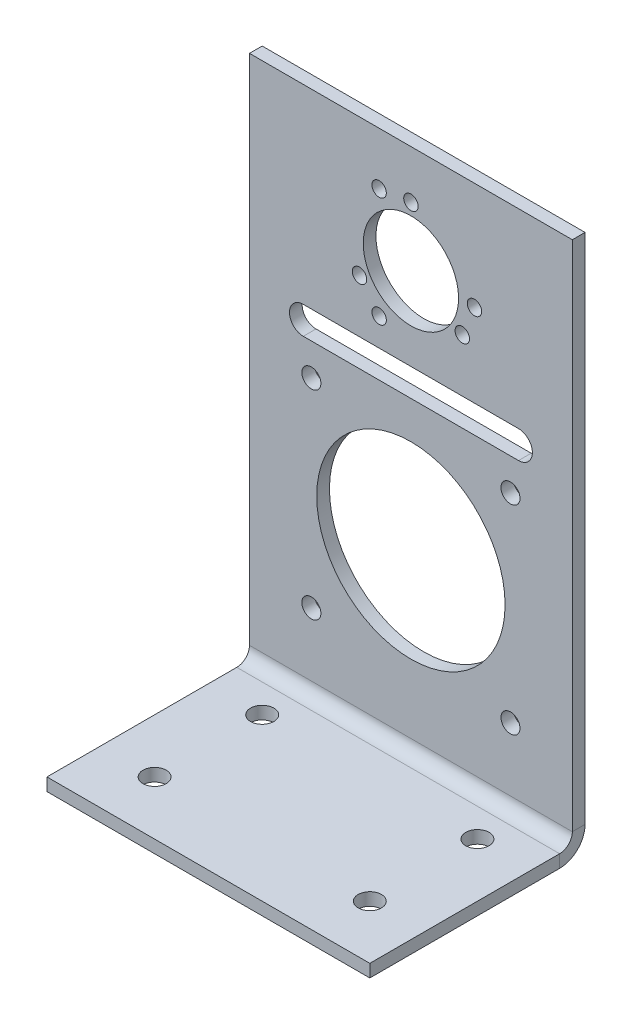
ISO-10303-21;
HEADER;
FILE_DESCRIPTION(('STEP AP214'),'2;1');
FILE_NAME('part.step','',(''),(''),'','','');
FILE_SCHEMA(('AUTOMOTIVE_DESIGN { 1 0 10303 214 1 1 1 1 }'));
ENDSEC;
DATA;
#1=APPLICATION_CONTEXT('core data for automotive mechanical design processes');
#2=APPLICATION_PROTOCOL_DEFINITION('international standard','automotive_design',2000,#1);
#3=PRODUCT_CONTEXT('',#1,'mechanical');
#4=PRODUCT('Part','Part','',(#3));
#5=PRODUCT_RELATED_PRODUCT_CATEGORY('part','',(#4));
#6=PRODUCT_DEFINITION_FORMATION('','',#4);
#7=PRODUCT_DEFINITION_CONTEXT('part definition',#1,'design');
#8=PRODUCT_DEFINITION('design','',#6,#7);
#9=PRODUCT_DEFINITION_SHAPE('','',#8);
#10=(LENGTH_UNIT() NAMED_UNIT(*) SI_UNIT(.MILLI.,.METRE.));
#11=(NAMED_UNIT(*) PLANE_ANGLE_UNIT() SI_UNIT($,.RADIAN.));
#12=(NAMED_UNIT(*) SI_UNIT($,.STERADIAN.) SOLID_ANGLE_UNIT());
#13=UNCERTAINTY_MEASURE_WITH_UNIT(LENGTH_MEASURE(1.E-05),#10,'distance_accuracy_value','');
#14=(GEOMETRIC_REPRESENTATION_CONTEXT(3) GLOBAL_UNCERTAINTY_ASSIGNED_CONTEXT((#13)) GLOBAL_UNIT_ASSIGNED_CONTEXT((#10,
#11,#12)) REPRESENTATION_CONTEXT('',''));
#15=CARTESIAN_POINT('',(0.,0.,0.));
#16=DIRECTION('',(0.,0.,1.));
#17=DIRECTION('',(1.,0.,0.));
#18=AXIS2_PLACEMENT_3D('',#15,#16,#17);
#19=CARTESIAN_POINT('',(38.1,0.,-25.4));
#20=DIRECTION('',(-1.,0.,0.));
#21=DIRECTION('',(0.,-1.,0.));
#22=AXIS2_PLACEMENT_3D('',#19,#20,#21);
#23=PLANE('',#22);
#24=DIRECTION('',(0.,0.,-1.));
#25=VECTOR('',#24,1.);
#26=CARTESIAN_POINT('',(38.1,3.00000000000002,-25.3999999999999));
#27=LINE('',#26,#25);
#28=CARTESIAN_POINT('',(38.1,2.99999999999997,-22.4));
#29=VERTEX_POINT('',#28);
#30=CARTESIAN_POINT('',(38.1,2.99999999999995,-25.4));
#31=VERTEX_POINT('',#30);
#32=EDGE_CURVE('E147',#29,#31,#27,.T.);
#33=ORIENTED_EDGE('',*,*,#32,.T.);
#34=DIRECTION('',(0.,-1.,0.));
#35=VECTOR('',#34,1.);
#36=CARTESIAN_POINT('',(38.1,0.,-25.4));
#37=LINE('',#36,#35);
#38=CARTESIAN_POINT('',(38.1,124.,-25.4000000000004));
#39=VERTEX_POINT('',#38);
#40=EDGE_CURVE('E149',#39,#31,#37,.T.);
#41=ORIENTED_EDGE('',*,*,#40,.F.);
#42=DIRECTION('',(0.,0.,1.));
#43=VECTOR('',#42,1.);
#44=CARTESIAN_POINT('',(38.1,124.,-25.4000000000004));
#45=LINE('',#44,#43);
#46=CARTESIAN_POINT('',(38.1,124.,-22.4000000000004));
#47=VERTEX_POINT('',#46);
#48=EDGE_CURVE('E347',#39,#47,#45,.T.);
#49=ORIENTED_EDGE('',*,*,#48,.T.);
#50=DIRECTION('',(0.,1.,0.));
#51=VECTOR('',#50,1.);
#52=CARTESIAN_POINT('',(38.1,0.,-22.4));
#53=LINE('',#52,#51);
#54=EDGE_CURVE('E81',#47,#29,#53,.F.);
#55=ORIENTED_EDGE('',*,*,#54,.T.);
#56=EDGE_LOOP('',(#33,#41,#49,#55));
#57=FACE_BOUND('',#56,.T.);
#58=ADVANCED_FACE('F59',(#57),#23,.F.);
#59=CARTESIAN_POINT('',(-38.1,124.,-25.4000000000004));
#60=DIRECTION('',(1.,0.,0.));
#61=DIRECTION('',(0.,1.,0.));
#62=AXIS2_PLACEMENT_3D('',#59,#60,#61);
#63=PLANE('',#62);
#64=DIRECTION('',(0.,0.,-1.));
#65=VECTOR('',#64,1.);
#66=CARTESIAN_POINT('',(-38.1,3.00000000000001,-22.4));
#67=LINE('',#66,#65);
#68=CARTESIAN_POINT('',(-38.1,2.99999999999997,-22.4));
#69=VERTEX_POINT('',#68);
#70=CARTESIAN_POINT('',(-38.1,3.00000000000002,-25.4));
#71=VERTEX_POINT('',#70);
#72=EDGE_CURVE('E13',#69,#71,#67,.T.);
#73=ORIENTED_EDGE('',*,*,#72,.F.);
#74=DIRECTION('',(0.,-1.,0.));
#75=VECTOR('',#74,1.);
#76=CARTESIAN_POINT('',(-38.1,124.,-22.4000000000004));
#77=LINE('',#76,#75);
#78=CARTESIAN_POINT('',(-38.1,124.,-22.4000000000004));
#79=VERTEX_POINT('',#78);
#80=EDGE_CURVE('E73',#69,#79,#77,.F.);
#81=ORIENTED_EDGE('',*,*,#80,.T.);
#82=DIRECTION('',(0.,0.,1.));
#83=VECTOR('',#82,1.);
#84=CARTESIAN_POINT('',(-38.1,124.,-25.4000000000004));
#85=LINE('',#84,#83);
#86=CARTESIAN_POINT('',(-38.1,124.,-25.4000000000004));
#87=VERTEX_POINT('',#86);
#88=EDGE_CURVE('E174',#87,#79,#85,.T.);
#89=ORIENTED_EDGE('',*,*,#88,.F.);
#90=DIRECTION('',(0.,1.,0.));
#91=VECTOR('',#90,1.);
#92=CARTESIAN_POINT('',(-38.1,0.,-25.4));
#93=LINE('',#92,#91);
#94=EDGE_CURVE('E163',#71,#87,#93,.T.);
#95=ORIENTED_EDGE('',*,*,#94,.F.);
#96=EDGE_LOOP('',(#73,#81,#89,#95));
#97=FACE_BOUND('',#96,.T.);
#98=ADVANCED_FACE('F388',(#97),#63,.F.);
#99=CARTESIAN_POINT('',(0.,0.,-25.4));
#100=DIRECTION('',(0.,0.,1.));
#101=DIRECTION('',(0.,-1.,0.));
#102=AXIS2_PLACEMENT_3D('',#99,#100,#101);
#103=PLANE('',#102);
#104=CARTESIAN_POINT('',(0.,98.6,-25.400000000004));
#105=DIRECTION('',(0.,0.,1.));
#106=DIRECTION('',(0.,-1.,0.));
#107=AXIS2_PLACEMENT_3D('',#104,#105,#106);
#108=CIRCLE('',#107,11.25);
#109=CARTESIAN_POINT('',(0.,87.35,-25.4000000000039));
#110=VERTEX_POINT('',#109);
#111=EDGE_CURVE('E242',#110,#110,#108,.T.);
#112=ORIENTED_EDGE('',*,*,#111,.T.);
#113=EDGE_LOOP('',(#112));
#114=FACE_BOUND('',#113,.T.);
#115=DIRECTION('',(-1.,0.,0.));
#116=VECTOR('',#115,1.);
#117=CARTESIAN_POINT('',(-25.4,79.0437094716167,-25.4000000000039));
#118=LINE('',#117,#116);
#119=CARTESIAN_POINT('',(25.4,79.0437094716167,-25.4000000000039));
#120=VERTEX_POINT('',#119);
#121=CARTESIAN_POINT('',(-25.4,79.0437094716167,-25.4000000000039));
#122=VERTEX_POINT('',#121);
#123=EDGE_CURVE('E260',#120,#122,#118,.T.);
#124=ORIENTED_EDGE('',*,*,#123,.T.);
#125=CARTESIAN_POINT('',(-25.4,75.7798094716167,-25.4000000000039));
#126=DIRECTION('',(0.,0.,1.));
#127=DIRECTION('',(0.,-1.,0.));
#128=AXIS2_PLACEMENT_3D('',#125,#126,#127);
#129=CIRCLE('',#128,3.2639);
#130=CARTESIAN_POINT('',(-25.4,72.5159094716167,-25.4000000000039));
#131=VERTEX_POINT('',#130);
#132=EDGE_CURVE('E250',#122,#131,#129,.T.);
#133=ORIENTED_EDGE('',*,*,#132,.T.);
#134=DIRECTION('',(1.,0.,0.));
#135=VECTOR('',#134,1.);
#136=CARTESIAN_POINT('',(-25.4,72.5159094716167,-25.4000000000039));
#137=LINE('',#136,#135);
#138=CARTESIAN_POINT('',(25.4,72.5159094716167,-25.4000000000002));
#139=VERTEX_POINT('',#138);
#140=EDGE_CURVE('E253',#131,#139,#137,.T.);
#141=ORIENTED_EDGE('',*,*,#140,.T.);
#142=CARTESIAN_POINT('',(25.4,75.7798094716167,-25.4000000000039));
#143=DIRECTION('',(0.,0.,1.));
#144=DIRECTION('',(0.,-1.,0.));
#145=AXIS2_PLACEMENT_3D('',#142,#143,#144);
#146=CIRCLE('',#145,3.2639);
#147=EDGE_CURVE('E257',#139,#120,#146,.T.);
#148=ORIENTED_EDGE('',*,*,#147,.T.);
#149=EDGE_LOOP('',(#124,#133,#141,#148));
#150=FACE_BOUND('',#149,.T.);
#151=CARTESIAN_POINT('',(12.1243556529822,91.6000000000001,-25.4000000000028));
#152=DIRECTION('',(0.,0.,1.));
#153=DIRECTION('',(0.,-1.,0.));
#154=AXIS2_PLACEMENT_3D('',#151,#152,#153);
#155=CIRCLE('',#154,1.7);
#156=CARTESIAN_POINT('',(12.1243556529822,89.9000000000001,-25.4000000000028));
#157=VERTEX_POINT('',#156);
#158=EDGE_CURVE('E282',#157,#157,#155,.T.);
#159=ORIENTED_EDGE('',*,*,#158,.T.);
#160=EDGE_LOOP('',(#159));
#161=FACE_BOUND('',#160,.T.);
#162=CARTESIAN_POINT('',(15.,98.6000000000002,-25.4000000000029));
#163=DIRECTION('',(0.,0.,1.));
#164=DIRECTION('',(0.,-1.,0.));
#165=AXIS2_PLACEMENT_3D('',#162,#163,#164);
#166=CIRCLE('',#165,1.7);
#167=CARTESIAN_POINT('',(15.,96.9000000000001,-25.4000000000029));
#168=VERTEX_POINT('',#167);
#169=EDGE_CURVE('E288',#168,#168,#166,.T.);
#170=ORIENTED_EDGE('',*,*,#169,.T.);
#171=EDGE_LOOP('',(#170));
#172=FACE_BOUND('',#171,.T.);
#173=CARTESIAN_POINT('',(-12.1243556529821,91.6,-25.4000000000028));
#174=DIRECTION('',(0.,0.,1.));
#175=DIRECTION('',(0.,-1.,0.));
#176=AXIS2_PLACEMENT_3D('',#173,#174,#175);
#177=CIRCLE('',#176,1.7);
#178=CARTESIAN_POINT('',(-12.1243556529821,89.8999999999999,-25.4000000000028));
#179=VERTEX_POINT('',#178);
#180=EDGE_CURVE('E294',#179,#179,#177,.T.);
#181=ORIENTED_EDGE('',*,*,#180,.T.);
#182=EDGE_LOOP('',(#181));
#183=FACE_BOUND('',#182,.T.);
#184=CARTESIAN_POINT('',(-7.49999999999992,85.6096189432334,-25.4000000000028));
#185=DIRECTION('',(0.,0.,1.));
#186=DIRECTION('',(0.,-1.,0.));
#187=AXIS2_PLACEMENT_3D('',#184,#185,#186);
#188=CIRCLE('',#187,1.7);
#189=CARTESIAN_POINT('',(-7.49999999999992,83.9096189432334,-25.4000000000028));
#190=VERTEX_POINT('',#189);
#191=EDGE_CURVE('E300',#190,#190,#188,.T.);
#192=ORIENTED_EDGE('',*,*,#191,.T.);
#193=EDGE_LOOP('',(#192));
#194=FACE_BOUND('',#193,.T.);
#195=CARTESIAN_POINT('',(0.,112.6,-25.4000000000029));
#196=DIRECTION('',(0.,0.,1.));
#197=DIRECTION('',(0.,-1.,0.));
#198=AXIS2_PLACEMENT_3D('',#195,#196,#197);
#199=CIRCLE('',#198,1.7);
#200=CARTESIAN_POINT('',(0.,110.9,-25.4000000000029));
#201=VERTEX_POINT('',#200);
#202=EDGE_CURVE('E306',#201,#201,#199,.T.);
#203=ORIENTED_EDGE('',*,*,#202,.T.);
#204=EDGE_LOOP('',(#203));
#205=FACE_BOUND('',#204,.T.);
#206=CARTESIAN_POINT('',(-7.50000000000001,111.590381056767,-25.4000000000029));
#207=DIRECTION('',(0.,0.,1.));
#208=DIRECTION('',(0.,-1.,0.));
#209=AXIS2_PLACEMENT_3D('',#206,#207,#208);
#210=CIRCLE('',#209,1.7);
#211=CARTESIAN_POINT('',(-7.50000000000001,109.890381056767,-25.4000000000029));
#212=VERTEX_POINT('',#211);
#213=EDGE_CURVE('E312',#212,#212,#210,.T.);
#214=ORIENTED_EDGE('',*,*,#213,.T.);
#215=EDGE_LOOP('',(#214));
#216=FACE_BOUND('',#215,.T.);
#217=CARTESIAN_POINT('',(0.,41.45,-25.4000000000022));
#218=DIRECTION('',(0.,0.,1.));
#219=DIRECTION('',(0.,-1.,0.));
#220=AXIS2_PLACEMENT_3D('',#217,#218,#219);
#221=CIRCLE('',#220,22.225);
#222=CARTESIAN_POINT('',(0.,19.225,-25.4000000000021));
#223=VERTEX_POINT('',#222);
#224=EDGE_CURVE('E316',#223,#223,#221,.T.);
#225=ORIENTED_EDGE('',*,*,#224,.T.);
#226=EDGE_LOOP('',(#225));
#227=FACE_BOUND('',#226,.T.);
#228=CARTESIAN_POINT('',(-23.5,17.95,-25.4000000000013));
#229=DIRECTION('',(0.,0.,1.));
#230=DIRECTION('',(0.,-1.,0.));
#231=AXIS2_PLACEMENT_3D('',#228,#229,#230);
#232=CIRCLE('',#231,2.25);
#233=CARTESIAN_POINT('',(-23.5,15.7,-25.4000000000013));
#234=VERTEX_POINT('',#233);
#235=EDGE_CURVE('E324',#234,#234,#232,.T.);
#236=ORIENTED_EDGE('',*,*,#235,.T.);
#237=EDGE_LOOP('',(#236));
#238=FACE_BOUND('',#237,.T.);
#239=CARTESIAN_POINT('',(23.5000000000001,64.95,-25.4000000000015));
#240=DIRECTION('',(0.,0.,1.));
#241=DIRECTION('',(0.,-1.,0.));
#242=AXIS2_PLACEMENT_3D('',#239,#240,#241);
#243=CIRCLE('',#242,2.25);
#244=CARTESIAN_POINT('',(23.5000000000001,62.7,-25.4000000000015));
#245=VERTEX_POINT('',#244);
#246=EDGE_CURVE('E330',#245,#245,#243,.T.);
#247=ORIENTED_EDGE('',*,*,#246,.T.);
#248=EDGE_LOOP('',(#247));
#249=FACE_BOUND('',#248,.T.);
#250=CARTESIAN_POINT('',(-23.4999999999999,64.95,-25.4000000000015));
#251=DIRECTION('',(0.,0.,1.));
#252=DIRECTION('',(0.,-1.,0.));
#253=AXIS2_PLACEMENT_3D('',#250,#251,#252);
#254=CIRCLE('',#253,2.25);
#255=CARTESIAN_POINT('',(-23.4999999999999,62.7,-25.4000000000015));
#256=VERTEX_POINT('',#255);
#257=EDGE_CURVE('E336',#256,#256,#254,.T.);
#258=ORIENTED_EDGE('',*,*,#257,.T.);
#259=EDGE_LOOP('',(#258));
#260=FACE_BOUND('',#259,.T.);
#261=CARTESIAN_POINT('',(23.5000000000001,17.95,-25.4000000000013));
#262=DIRECTION('',(0.,0.,1.));
#263=DIRECTION('',(0.,-1.,0.));
#264=AXIS2_PLACEMENT_3D('',#261,#262,#263);
#265=CIRCLE('',#264,2.25);
#266=CARTESIAN_POINT('',(23.5000000000001,15.7,-25.4000000000013));
#267=VERTEX_POINT('',#266);
#268=EDGE_CURVE('E342',#267,#267,#265,.T.);
#269=ORIENTED_EDGE('',*,*,#268,.T.);
#270=EDGE_LOOP('',(#269));
#271=FACE_BOUND('',#270,.T.);
#272=DIRECTION('',(1.,0.,0.));
#273=VECTOR('',#272,1.);
#274=CARTESIAN_POINT('',(38.1,3.00000000000002,-25.4));
#275=LINE('',#274,#273);
#276=EDGE_CURVE('E154',#71,#31,#275,.T.);
#277=ORIENTED_EDGE('',*,*,#276,.F.);
#278=ORIENTED_EDGE('',*,*,#94,.T.);
#279=DIRECTION('',(1.,0.,0.));
#280=VECTOR('',#279,1.);
#281=CARTESIAN_POINT('',(0.,124.,-25.4000000000004));
#282=LINE('',#281,#280);
#283=EDGE_CURVE('E161',#87,#39,#282,.T.);
#284=ORIENTED_EDGE('',*,*,#283,.T.);
#285=ORIENTED_EDGE('',*,*,#40,.T.);
#286=EDGE_LOOP('',(#277,#278,#284,#285));
#287=FACE_BOUND('',#286,.T.);
#288=ADVANCED_FACE('F158',(#114,#150,#161,#172,#183,#194,#205,#216,#227,#238,#249,#260,#271,
#287),#103,.F.);
#289=CARTESIAN_POINT('',(0.,0.,-22.4));
#290=DIRECTION('',(0.,0.,1.));
#291=DIRECTION('',(0.,-1.,0.));
#292=AXIS2_PLACEMENT_3D('',#289,#290,#291);
#293=PLANE('',#292);
#294=CARTESIAN_POINT('',(0.,98.6,-22.4000000000005));
#295=DIRECTION('',(0.,0.,1.));
#296=DIRECTION('',(0.,-1.,0.));
#297=AXIS2_PLACEMENT_3D('',#294,#295,#296);
#298=CIRCLE('',#297,11.25);
#299=CARTESIAN_POINT('',(0.,87.35,-22.4000000000004));
#300=VERTEX_POINT('',#299);
#301=EDGE_CURVE('E246',#300,#300,#298,.T.);
#302=ORIENTED_EDGE('',*,*,#301,.F.);
#303=EDGE_LOOP('',(#302));
#304=FACE_BOUND('',#303,.T.);
#305=CARTESIAN_POINT('',(-25.4,75.7798094716167,-22.4000000000004));
#306=DIRECTION('',(0.,0.,1.));
#307=DIRECTION('',(0.,-1.,0.));
#308=AXIS2_PLACEMENT_3D('',#305,#306,#307);
#309=CIRCLE('',#308,3.2639);
#310=CARTESIAN_POINT('',(-25.4,79.0437094716167,-22.4000000000004));
#311=VERTEX_POINT('',#310);
#312=CARTESIAN_POINT('',(-25.4,72.5159094716167,-22.4000000000002));
#313=VERTEX_POINT('',#312);
#314=EDGE_CURVE('E192',#311,#313,#309,.T.);
#315=ORIENTED_EDGE('',*,*,#314,.F.);
#316=DIRECTION('',(-1.,0.,0.));
#317=VECTOR('',#316,1.);
#318=CARTESIAN_POINT('',(-25.4,79.0437094716167,-22.4000000000004));
#319=LINE('',#318,#317);
#320=CARTESIAN_POINT('',(25.4,79.0437094716167,-22.4000000000004));
#321=VERTEX_POINT('',#320);
#322=EDGE_CURVE('E254',#321,#311,#319,.T.);
#323=ORIENTED_EDGE('',*,*,#322,.F.);
#324=CARTESIAN_POINT('',(25.4,75.7798094716167,-22.4000000000004));
#325=DIRECTION('',(0.,0.,1.));
#326=DIRECTION('',(0.,-1.,0.));
#327=AXIS2_PLACEMENT_3D('',#324,#325,#326);
#328=CIRCLE('',#327,3.2639);
#329=CARTESIAN_POINT('',(25.4,72.5159094716167,-22.4000000000004));
#330=VERTEX_POINT('',#329);
#331=EDGE_CURVE('E268',#330,#321,#328,.T.);
#332=ORIENTED_EDGE('',*,*,#331,.F.);
#333=DIRECTION('',(1.,0.,0.));
#334=VECTOR('',#333,1.);
#335=CARTESIAN_POINT('',(-25.4,72.5159094716167,-22.4000000000004));
#336=LINE('',#335,#334);
#337=EDGE_CURVE('E265',#313,#330,#336,.T.);
#338=ORIENTED_EDGE('',*,*,#337,.F.);
#339=EDGE_LOOP('',(#315,#323,#332,#338));
#340=FACE_BOUND('',#339,.T.);
#341=CARTESIAN_POINT('',(12.1243556529822,91.6000000000001,-22.4000000000004));
#342=DIRECTION('',(0.,0.,1.));
#343=DIRECTION('',(0.,-1.,0.));
#344=AXIS2_PLACEMENT_3D('',#341,#342,#343);
#345=CIRCLE('',#344,1.7);
#346=CARTESIAN_POINT('',(12.1243556529822,89.9000000000001,-22.4000000000004));
#347=VERTEX_POINT('',#346);
#348=EDGE_CURVE('E245',#347,#347,#345,.T.);
#349=ORIENTED_EDGE('',*,*,#348,.F.);
#350=EDGE_LOOP('',(#349));
#351=FACE_BOUND('',#350,.T.);
#352=CARTESIAN_POINT('',(15.,98.6000000000002,-22.4000000000005));
#353=DIRECTION('',(0.,0.,1.));
#354=DIRECTION('',(0.,-1.,0.));
#355=AXIS2_PLACEMENT_3D('',#352,#353,#354);
#356=CIRCLE('',#355,1.7);
#357=CARTESIAN_POINT('',(15.,96.9000000000001,-22.4000000000005));
#358=VERTEX_POINT('',#357);
#359=EDGE_CURVE('E285',#358,#358,#356,.T.);
#360=ORIENTED_EDGE('',*,*,#359,.F.);
#361=EDGE_LOOP('',(#360));
#362=FACE_BOUND('',#361,.T.);
#363=CARTESIAN_POINT('',(-12.1243556529821,91.6,-22.4000000000004));
#364=DIRECTION('',(0.,0.,1.));
#365=DIRECTION('',(0.,-1.,0.));
#366=AXIS2_PLACEMENT_3D('',#363,#364,#365);
#367=CIRCLE('',#366,1.7);
#368=CARTESIAN_POINT('',(-12.1243556529821,89.8999999999999,-22.4000000000004));
#369=VERTEX_POINT('',#368);
#370=EDGE_CURVE('E291',#369,#369,#367,.T.);
#371=ORIENTED_EDGE('',*,*,#370,.F.);
#372=EDGE_LOOP('',(#371));
#373=FACE_BOUND('',#372,.T.);
#374=CARTESIAN_POINT('',(-7.49999999999992,85.6096189432334,-22.4000000000004));
#375=DIRECTION('',(0.,0.,1.));
#376=DIRECTION('',(0.,-1.,0.));
#377=AXIS2_PLACEMENT_3D('',#374,#375,#376);
#378=CIRCLE('',#377,1.7);
#379=CARTESIAN_POINT('',(-7.49999999999992,83.9096189432334,-22.4000000000004));
#380=VERTEX_POINT('',#379);
#381=EDGE_CURVE('E297',#380,#380,#378,.T.);
#382=ORIENTED_EDGE('',*,*,#381,.F.);
#383=EDGE_LOOP('',(#382));
#384=FACE_BOUND('',#383,.T.);
#385=CARTESIAN_POINT('',(0.,112.6,-22.4000000000005));
#386=DIRECTION('',(0.,0.,1.));
#387=DIRECTION('',(0.,-1.,0.));
#388=AXIS2_PLACEMENT_3D('',#385,#386,#387);
#389=CIRCLE('',#388,1.7);
#390=CARTESIAN_POINT('',(0.,110.9,-22.4000000000005));
#391=VERTEX_POINT('',#390);
#392=EDGE_CURVE('E303',#391,#391,#389,.T.);
#393=ORIENTED_EDGE('',*,*,#392,.F.);
#394=EDGE_LOOP('',(#393));
#395=FACE_BOUND('',#394,.T.);
#396=CARTESIAN_POINT('',(-7.50000000000001,111.590381056767,-22.4000000000005));
#397=DIRECTION('',(0.,0.,1.));
#398=DIRECTION('',(0.,-1.,0.));
#399=AXIS2_PLACEMENT_3D('',#396,#397,#398);
#400=CIRCLE('',#399,1.7);
#401=CARTESIAN_POINT('',(-7.50000000000001,109.890381056767,-22.4000000000005));
#402=VERTEX_POINT('',#401);
#403=EDGE_CURVE('E309',#402,#402,#400,.T.);
#404=ORIENTED_EDGE('',*,*,#403,.F.);
#405=EDGE_LOOP('',(#404));
#406=FACE_BOUND('',#405,.T.);
#407=CARTESIAN_POINT('',(0.,41.45,-22.4000000000003));
#408=DIRECTION('',(0.,0.,1.));
#409=DIRECTION('',(0.,-1.,0.));
#410=AXIS2_PLACEMENT_3D('',#407,#408,#409);
#411=CIRCLE('',#410,22.225);
#412=CARTESIAN_POINT('',(0.,19.225,-22.4000000000002));
#413=VERTEX_POINT('',#412);
#414=EDGE_CURVE('E315',#413,#413,#411,.T.);
#415=ORIENTED_EDGE('',*,*,#414,.F.);
#416=EDGE_LOOP('',(#415));
#417=FACE_BOUND('',#416,.T.);
#418=CARTESIAN_POINT('',(-23.5,17.95,-22.4000000000002));
#419=DIRECTION('',(0.,0.,1.));
#420=DIRECTION('',(0.,-1.,0.));
#421=AXIS2_PLACEMENT_3D('',#418,#419,#420);
#422=CIRCLE('',#421,2.25);
#423=CARTESIAN_POINT('',(-23.5,15.7,-22.4000000000002));
#424=VERTEX_POINT('',#423);
#425=EDGE_CURVE('E319',#424,#424,#422,.T.);
#426=ORIENTED_EDGE('',*,*,#425,.F.);
#427=EDGE_LOOP('',(#426));
#428=FACE_BOUND('',#427,.T.);
#429=CARTESIAN_POINT('',(23.5000000000001,64.95,-22.4000000000003));
#430=DIRECTION('',(0.,0.,1.));
#431=DIRECTION('',(0.,-1.,0.));
#432=AXIS2_PLACEMENT_3D('',#429,#430,#431);
#433=CIRCLE('',#432,2.25);
#434=CARTESIAN_POINT('',(23.5000000000001,62.7,-22.4000000000003));
#435=VERTEX_POINT('',#434);
#436=EDGE_CURVE('E327',#435,#435,#433,.T.);
#437=ORIENTED_EDGE('',*,*,#436,.F.);
#438=EDGE_LOOP('',(#437));
#439=FACE_BOUND('',#438,.T.);
#440=CARTESIAN_POINT('',(-23.4999999999999,64.95,-22.4000000000003));
#441=DIRECTION('',(0.,0.,1.));
#442=DIRECTION('',(0.,-1.,0.));
#443=AXIS2_PLACEMENT_3D('',#440,#441,#442);
#444=CIRCLE('',#443,2.25);
#445=CARTESIAN_POINT('',(-23.4999999999999,62.7,-22.4000000000003));
#446=VERTEX_POINT('',#445);
#447=EDGE_CURVE('E333',#446,#446,#444,.T.);
#448=ORIENTED_EDGE('',*,*,#447,.F.);
#449=EDGE_LOOP('',(#448));
#450=FACE_BOUND('',#449,.T.);
#451=CARTESIAN_POINT('',(23.5000000000001,17.95,-22.4000000000002));
#452=DIRECTION('',(0.,0.,1.));
#453=DIRECTION('',(0.,-1.,0.));
#454=AXIS2_PLACEMENT_3D('',#451,#452,#453);
#455=CIRCLE('',#454,2.25);
#456=CARTESIAN_POINT('',(23.5000000000001,15.7,-22.4000000000002));
#457=VERTEX_POINT('',#456);
#458=EDGE_CURVE('E339',#457,#457,#455,.T.);
#459=ORIENTED_EDGE('',*,*,#458,.F.);
#460=EDGE_LOOP('',(#459));
#461=FACE_BOUND('',#460,.T.);
#462=ORIENTED_EDGE('',*,*,#80,.F.);
#463=DIRECTION('',(-1.,0.,0.));
#464=VECTOR('',#463,1.);
#465=CARTESIAN_POINT('',(38.1,3.00000000000001,-22.4));
#466=LINE('',#465,#464);
#467=EDGE_CURVE('E66',#29,#69,#466,.T.);
#468=ORIENTED_EDGE('',*,*,#467,.F.);
#469=ORIENTED_EDGE('',*,*,#54,.F.);
#470=DIRECTION('',(-1.,0.,0.));
#471=VECTOR('',#470,1.);
#472=CARTESIAN_POINT('',(38.1,124.,-22.4000000000004));
#473=LINE('',#472,#471);
#474=EDGE_CURVE('E164',#79,#47,#473,.F.);
#475=ORIENTED_EDGE('',*,*,#474,.F.);
#476=EDGE_LOOP('',(#462,#468,#469,#475));
#477=FACE_BOUND('',#476,.T.);
#478=ADVANCED_FACE('F396',(#304,#340,#351,#362,#373,#384,#395,#406,#417,#428,#439,#450,#461,
#477),#293,.T.);
#479=CARTESIAN_POINT('',(38.1,124.,-25.4000000000004));
#480=DIRECTION('',(0.,-1.,0.));
#481=DIRECTION('',(0.,0.,-1.));
#482=AXIS2_PLACEMENT_3D('',#479,#480,#481);
#483=PLANE('',#482);
#484=ORIENTED_EDGE('',*,*,#474,.T.);
#485=ORIENTED_EDGE('',*,*,#48,.F.);
#486=ORIENTED_EDGE('',*,*,#283,.F.);
#487=ORIENTED_EDGE('',*,*,#88,.T.);
#488=EDGE_LOOP('',(#484,#485,#486,#487));
#489=FACE_BOUND('',#488,.T.);
#490=ADVANCED_FACE('F400',(#489),#483,.F.);
#491=CARTESIAN_POINT('',(23.5000000000001,17.95,-22.4000000000002));
#492=DIRECTION('',(0.,0.,1.));
#493=DIRECTION('',(0.,-1.,0.));
#494=AXIS2_PLACEMENT_3D('',#491,#492,#493);
#495=CYLINDRICAL_SURFACE('',#494,2.25);
#496=ORIENTED_EDGE('',*,*,#268,.F.);
#497=EDGE_LOOP('',(#496));
#498=FACE_BOUND('',#497,.T.);
#499=ORIENTED_EDGE('',*,*,#458,.T.);
#500=EDGE_LOOP('',(#499));
#501=FACE_BOUND('',#500,.T.);
#502=ADVANCED_FACE('F403',(#498,#501),#495,.F.);
#503=CARTESIAN_POINT('',(-23.4999999999999,64.95,-22.4000000000003));
#504=DIRECTION('',(0.,0.,1.));
#505=DIRECTION('',(0.,-1.,0.));
#506=AXIS2_PLACEMENT_3D('',#503,#504,#505);
#507=CYLINDRICAL_SURFACE('',#506,2.25);
#508=ORIENTED_EDGE('',*,*,#257,.F.);
#509=EDGE_LOOP('',(#508));
#510=FACE_BOUND('',#509,.T.);
#511=ORIENTED_EDGE('',*,*,#447,.T.);
#512=EDGE_LOOP('',(#511));
#513=FACE_BOUND('',#512,.T.);
#514=ADVANCED_FACE('F410',(#510,#513),#507,.F.);
#515=CARTESIAN_POINT('',(23.5000000000001,64.95,-22.4000000000003));
#516=DIRECTION('',(0.,0.,1.));
#517=DIRECTION('',(0.,-1.,0.));
#518=AXIS2_PLACEMENT_3D('',#515,#516,#517);
#519=CYLINDRICAL_SURFACE('',#518,2.25);
#520=ORIENTED_EDGE('',*,*,#246,.F.);
#521=EDGE_LOOP('',(#520));
#522=FACE_BOUND('',#521,.T.);
#523=ORIENTED_EDGE('',*,*,#436,.T.);
#524=EDGE_LOOP('',(#523));
#525=FACE_BOUND('',#524,.T.);
#526=ADVANCED_FACE('F414',(#522,#525),#519,.F.);
#527=CARTESIAN_POINT('',(-23.5,17.95,-22.4000000000002));
#528=DIRECTION('',(0.,0.,1.));
#529=DIRECTION('',(0.,-1.,0.));
#530=AXIS2_PLACEMENT_3D('',#527,#528,#529);
#531=CYLINDRICAL_SURFACE('',#530,2.25);
#532=ORIENTED_EDGE('',*,*,#235,.F.);
#533=EDGE_LOOP('',(#532));
#534=FACE_BOUND('',#533,.T.);
#535=ORIENTED_EDGE('',*,*,#425,.T.);
#536=EDGE_LOOP('',(#535));
#537=FACE_BOUND('',#536,.T.);
#538=ADVANCED_FACE('F418',(#534,#537),#531,.F.);
#539=CARTESIAN_POINT('',(0.,41.45,-25.4000000000022));
#540=DIRECTION('',(0.,0.,1.));
#541=DIRECTION('',(0.,-1.,0.));
#542=AXIS2_PLACEMENT_3D('',#539,#540,#541);
#543=CYLINDRICAL_SURFACE('',#542,22.225);
#544=ORIENTED_EDGE('',*,*,#224,.F.);
#545=EDGE_LOOP('',(#544));
#546=FACE_BOUND('',#545,.T.);
#547=ORIENTED_EDGE('',*,*,#414,.T.);
#548=EDGE_LOOP('',(#547));
#549=FACE_BOUND('',#548,.T.);
#550=ADVANCED_FACE('F422',(#546,#549),#543,.F.);
#551=CARTESIAN_POINT('',(-7.50000000000001,111.590381056767,-22.4000000000005));
#552=DIRECTION('',(0.,0.,1.));
#553=DIRECTION('',(0.,-1.,0.));
#554=AXIS2_PLACEMENT_3D('',#551,#552,#553);
#555=CYLINDRICAL_SURFACE('',#554,1.7);
#556=ORIENTED_EDGE('',*,*,#213,.F.);
#557=EDGE_LOOP('',(#556));
#558=FACE_BOUND('',#557,.T.);
#559=ORIENTED_EDGE('',*,*,#403,.T.);
#560=EDGE_LOOP('',(#559));
#561=FACE_BOUND('',#560,.T.);
#562=ADVANCED_FACE('F426',(#558,#561),#555,.F.);
#563=CARTESIAN_POINT('',(0.,112.6,-22.4000000000005));
#564=DIRECTION('',(0.,0.,1.));
#565=DIRECTION('',(0.,-1.,0.));
#566=AXIS2_PLACEMENT_3D('',#563,#564,#565);
#567=CYLINDRICAL_SURFACE('',#566,1.7);
#568=ORIENTED_EDGE('',*,*,#202,.F.);
#569=EDGE_LOOP('',(#568));
#570=FACE_BOUND('',#569,.T.);
#571=ORIENTED_EDGE('',*,*,#392,.T.);
#572=EDGE_LOOP('',(#571));
#573=FACE_BOUND('',#572,.T.);
#574=ADVANCED_FACE('F430',(#570,#573),#567,.F.);
#575=CARTESIAN_POINT('',(-7.49999999999992,85.6096189432334,-22.4000000000004));
#576=DIRECTION('',(0.,0.,1.));
#577=DIRECTION('',(0.,-1.,0.));
#578=AXIS2_PLACEMENT_3D('',#575,#576,#577);
#579=CYLINDRICAL_SURFACE('',#578,1.7);
#580=ORIENTED_EDGE('',*,*,#191,.F.);
#581=EDGE_LOOP('',(#580));
#582=FACE_BOUND('',#581,.T.);
#583=ORIENTED_EDGE('',*,*,#381,.T.);
#584=EDGE_LOOP('',(#583));
#585=FACE_BOUND('',#584,.T.);
#586=ADVANCED_FACE('F434',(#582,#585),#579,.F.);
#587=CARTESIAN_POINT('',(-12.1243556529821,91.6,-22.4000000000004));
#588=DIRECTION('',(0.,0.,1.));
#589=DIRECTION('',(0.,-1.,0.));
#590=AXIS2_PLACEMENT_3D('',#587,#588,#589);
#591=CYLINDRICAL_SURFACE('',#590,1.7);
#592=ORIENTED_EDGE('',*,*,#180,.F.);
#593=EDGE_LOOP('',(#592));
#594=FACE_BOUND('',#593,.T.);
#595=ORIENTED_EDGE('',*,*,#370,.T.);
#596=EDGE_LOOP('',(#595));
#597=FACE_BOUND('',#596,.T.);
#598=ADVANCED_FACE('F438',(#594,#597),#591,.F.);
#599=CARTESIAN_POINT('',(15.,98.6000000000002,-22.4000000000005));
#600=DIRECTION('',(0.,0.,1.));
#601=DIRECTION('',(0.,-1.,0.));
#602=AXIS2_PLACEMENT_3D('',#599,#600,#601);
#603=CYLINDRICAL_SURFACE('',#602,1.7);
#604=ORIENTED_EDGE('',*,*,#169,.F.);
#605=EDGE_LOOP('',(#604));
#606=FACE_BOUND('',#605,.T.);
#607=ORIENTED_EDGE('',*,*,#359,.T.);
#608=EDGE_LOOP('',(#607));
#609=FACE_BOUND('',#608,.T.);
#610=ADVANCED_FACE('F442',(#606,#609),#603,.F.);
#611=CARTESIAN_POINT('',(12.1243556529822,91.6000000000001,-22.4000000000004));
#612=DIRECTION('',(0.,0.,1.));
#613=DIRECTION('',(0.,-1.,0.));
#614=AXIS2_PLACEMENT_3D('',#611,#612,#613);
#615=CYLINDRICAL_SURFACE('',#614,1.7);
#616=ORIENTED_EDGE('',*,*,#158,.F.);
#617=EDGE_LOOP('',(#616));
#618=FACE_BOUND('',#617,.T.);
#619=ORIENTED_EDGE('',*,*,#348,.T.);
#620=EDGE_LOOP('',(#619));
#621=FACE_BOUND('',#620,.T.);
#622=ADVANCED_FACE('F446',(#618,#621),#615,.F.);
#623=CARTESIAN_POINT('',(-25.4,75.7798094716167,-25.4000000000039));
#624=DIRECTION('',(0.,0.,1.));
#625=DIRECTION('',(0.,-1.,0.));
#626=AXIS2_PLACEMENT_3D('',#623,#624,#625);
#627=CYLINDRICAL_SURFACE('',#626,3.2639);
#628=ORIENTED_EDGE('',*,*,#314,.T.);
#629=DIRECTION('',(0.,0.,1.));
#630=VECTOR('',#629,1.);
#631=CARTESIAN_POINT('',(-25.4,72.5159094716167,-25.4000000000039));
#632=LINE('',#631,#630);
#633=EDGE_CURVE('E263',#131,#313,#632,.T.);
#634=ORIENTED_EDGE('',*,*,#633,.F.);
#635=ORIENTED_EDGE('',*,*,#132,.F.);
#636=DIRECTION('',(0.,0.,1.));
#637=VECTOR('',#636,1.);
#638=CARTESIAN_POINT('',(-25.4,79.0437094716167,-25.4000000000039));
#639=LINE('',#638,#637);
#640=EDGE_CURVE('E249',#122,#311,#639,.T.);
#641=ORIENTED_EDGE('',*,*,#640,.T.);
#642=EDGE_LOOP('',(#628,#634,#635,#641));
#643=FACE_BOUND('',#642,.T.);
#644=ADVANCED_FACE('F450',(#643),#627,.F.);
#645=CARTESIAN_POINT('',(-25.4,79.0437094716167,-25.4000000000039));
#646=DIRECTION('',(0.,1.,0.));
#647=DIRECTION('',(0.,0.,1.));
#648=AXIS2_PLACEMENT_3D('',#645,#646,#647);
#649=PLANE('',#648);
#650=ORIENTED_EDGE('',*,*,#322,.T.);
#651=ORIENTED_EDGE('',*,*,#640,.F.);
#652=ORIENTED_EDGE('',*,*,#123,.F.);
#653=DIRECTION('',(0.,0.,1.));
#654=VECTOR('',#653,1.);
#655=CARTESIAN_POINT('',(25.4,79.0437094716167,-25.4000000000039));
#656=LINE('',#655,#654);
#657=EDGE_CURVE('E274',#120,#321,#656,.T.);
#658=ORIENTED_EDGE('',*,*,#657,.T.);
#659=EDGE_LOOP('',(#650,#651,#652,#658));
#660=FACE_BOUND('',#659,.T.);
#661=ADVANCED_FACE('F454',(#660),#649,.F.);
#662=CARTESIAN_POINT('',(25.4,75.7798094716167,-25.4000000000039));
#663=DIRECTION('',(0.,0.,1.));
#664=DIRECTION('',(0.,-1.,0.));
#665=AXIS2_PLACEMENT_3D('',#662,#663,#664);
#666=CYLINDRICAL_SURFACE('',#665,3.2639);
#667=ORIENTED_EDGE('',*,*,#331,.T.);
#668=ORIENTED_EDGE('',*,*,#657,.F.);
#669=ORIENTED_EDGE('',*,*,#147,.F.);
#670=DIRECTION('',(0.,0.,1.));
#671=VECTOR('',#670,1.);
#672=CARTESIAN_POINT('',(25.4,72.5159094716167,-25.4000000000039));
#673=LINE('',#672,#671);
#674=EDGE_CURVE('E276',#139,#330,#673,.T.);
#675=ORIENTED_EDGE('',*,*,#674,.T.);
#676=EDGE_LOOP('',(#667,#668,#669,#675));
#677=FACE_BOUND('',#676,.T.);
#678=ADVANCED_FACE('F460',(#677),#666,.F.);
#679=CARTESIAN_POINT('',(-25.4,72.5159094716167,-25.4000000000039));
#680=DIRECTION('',(0.,-1.,0.));
#681=DIRECTION('',(0.,0.,-1.));
#682=AXIS2_PLACEMENT_3D('',#679,#680,#681);
#683=PLANE('',#682);
#684=ORIENTED_EDGE('',*,*,#337,.T.);
#685=ORIENTED_EDGE('',*,*,#674,.F.);
#686=ORIENTED_EDGE('',*,*,#140,.F.);
#687=ORIENTED_EDGE('',*,*,#633,.T.);
#688=EDGE_LOOP('',(#684,#685,#686,#687));
#689=FACE_BOUND('',#688,.T.);
#690=ADVANCED_FACE('F456',(#689),#683,.F.);
#691=CARTESIAN_POINT('',(0.,98.6,-25.400000000004));
#692=DIRECTION('',(0.,0.,1.));
#693=DIRECTION('',(0.,-1.,0.));
#694=AXIS2_PLACEMENT_3D('',#691,#692,#693);
#695=CYLINDRICAL_SURFACE('',#694,11.25);
#696=CARTESIAN_POINT('',(0.,87.35,-25.4000000000039));
#697=CARTESIAN_POINT('',(0.,87.35,-25.3687500000039));
#698=CARTESIAN_POINT('',(0.,87.35,-25.3375000000039));
#699=CARTESIAN_POINT('',(0.,87.35,-25.2750000000038));
#700=CARTESIAN_POINT('',(0.,87.35,-25.2437500000038));
#701=CARTESIAN_POINT('',(0.,87.35,-25.1812500000037));
#702=CARTESIAN_POINT('',(0.,87.35,-25.1500000000036));
#703=CARTESIAN_POINT('',(0.,87.35,-25.0875000000036));
#704=CARTESIAN_POINT('',(0.,87.35,-25.0562500000035));
#705=CARTESIAN_POINT('',(0.,87.35,-24.9937500000035));
#706=CARTESIAN_POINT('',(0.,87.35,-24.9625000000034));
#707=CARTESIAN_POINT('',(0.,87.35,-24.9000000000033));
#708=CARTESIAN_POINT('',(0.,87.35,-24.8687500000033));
#709=CARTESIAN_POINT('',(0.,87.35,-24.8062500000032));
#710=CARTESIAN_POINT('',(0.,87.35,-24.7750000000032));
#711=CARTESIAN_POINT('',(0.,87.35,-24.7125000000031));
#712=CARTESIAN_POINT('',(0.,87.35,-24.6812500000031));
#713=CARTESIAN_POINT('',(0.,87.35,-24.618750000003));
#714=CARTESIAN_POINT('',(0.,87.35,-24.587500000003));
#715=CARTESIAN_POINT('',(0.,87.35,-24.5250000000029));
#716=CARTESIAN_POINT('',(0.,87.35,-24.4937500000029));
#717=CARTESIAN_POINT('',(0.,87.35,-24.4312500000028));
#718=CARTESIAN_POINT('',(0.,87.35,-24.4000000000028));
#719=CARTESIAN_POINT('',(0.,87.35,-24.3375000000027));
#720=CARTESIAN_POINT('',(0.,87.35,-24.3062500000027));
#721=CARTESIAN_POINT('',(0.,87.35,-24.2437500000026));
#722=CARTESIAN_POINT('',(0.,87.35,-24.2125000000025));
#723=CARTESIAN_POINT('',(0.,87.35,-24.1500000000025));
#724=CARTESIAN_POINT('',(0.,87.35,-24.1187500000024));
#725=CARTESIAN_POINT('',(0.,87.35,-24.0562500000024));
#726=CARTESIAN_POINT('',(0.,87.35,-24.0250000000023));
#727=CARTESIAN_POINT('',(0.,87.35,-23.9625000000023));
#728=CARTESIAN_POINT('',(0.,87.35,-23.9312500000022));
#729=CARTESIAN_POINT('',(0.,87.35,-23.8687500000021));
#730=CARTESIAN_POINT('',(0.,87.35,-23.8375000000021));
#731=CARTESIAN_POINT('',(0.,87.35,-23.775000000002));
#732=CARTESIAN_POINT('',(0.,87.35,-23.743750000002));
#733=CARTESIAN_POINT('',(0.,87.35,-23.6812500000019));
#734=CARTESIAN_POINT('',(0.,87.35,-23.6500000000019));
#735=CARTESIAN_POINT('',(0.,87.35,-23.5875000000018));
#736=CARTESIAN_POINT('',(0.,87.35,-23.5562500000018));
#737=CARTESIAN_POINT('',(0.,87.35,-23.4937500000017));
#738=CARTESIAN_POINT('',(0.,87.35,-23.4625000000017));
#739=CARTESIAN_POINT('',(0.,87.35,-23.4000000000016));
#740=CARTESIAN_POINT('',(0.,87.35,-23.3687500000016));
#741=CARTESIAN_POINT('',(0.,87.35,-23.3062500000015));
#742=CARTESIAN_POINT('',(0.,87.35,-23.2750000000014));
#743=CARTESIAN_POINT('',(0.,87.35,-23.2125000000014));
#744=CARTESIAN_POINT('',(0.,87.35,-23.1812500000013));
#745=CARTESIAN_POINT('',(0.,87.35,-23.1187500000013));
#746=CARTESIAN_POINT('',(0.,87.35,-23.0875000000012));
#747=CARTESIAN_POINT('',(0.,87.35,-23.0250000000012));
#748=CARTESIAN_POINT('',(0.,87.35,-22.9937500000011));
#749=CARTESIAN_POINT('',(0.,87.35,-22.931250000001));
#750=CARTESIAN_POINT('',(0.,87.35,-22.900000000001));
#751=CARTESIAN_POINT('',(0.,87.35,-22.8375000000009));
#752=CARTESIAN_POINT('',(0.,87.35,-22.8062500000009));
#753=CARTESIAN_POINT('',(0.,87.35,-22.7437500000008));
#754=CARTESIAN_POINT('',(0.,87.35,-22.7125000000008));
#755=CARTESIAN_POINT('',(0.,87.35,-22.6500000000007));
#756=CARTESIAN_POINT('',(0.,87.35,-22.6187500000007));
#757=CARTESIAN_POINT('',(0.,87.35,-22.5562500000006));
#758=CARTESIAN_POINT('',(0.,87.35,-22.5250000000006));
#759=CARTESIAN_POINT('',(0.,87.35,-22.4625000000005));
#760=CARTESIAN_POINT('',(0.,87.35,-22.4312500000005));
#761=CARTESIAN_POINT('',(0.,87.35,-22.4000000000004));
#762=B_SPLINE_CURVE_WITH_KNOTS('',3,(#696,#697,#698,#699,#700,#701,#702,#703,#704,#705,#706,
#707,#708,#709,#710,#711,#712,#713,#714,#715,#716,#717,#718,#719,#720,#721,#722,#723,#724,#725,
#726,#727,#728,#729,#730,#731,#732,#733,#734,#735,#736,#737,#738,#739,#740,#741,#742,#743,#744,
#745,#746,#747,#748,#749,#750,#751,#752,#753,#754,#755,#756,#757,#758,#759,#760,#761),
.UNSPECIFIED.,.F.,.F.,(4,2,2,2,2,2,2,2,2,2,2,2,2,2,2,2,2,2,2,2,2,2,2,2,2,2,2,2,2,2,2,2,4),(0.,
0.0937500000001076,0.187500000000219,0.281250000000326,0.375000000000437,0.468750000000545,
0.562500000000656,0.656250000000767,0.750000000000875,0.843750000000986,0.937500000001094,
1.0312500000012,1.12500000000132,1.21875000000142,1.31250000000153,1.40625000000164,
1.50000000000175,1.59375000000186,1.68750000000197,1.78125000000208,1.87500000000219,
1.9687500000023,2.06250000000241,2.15625000000252,2.25000000000263,2.34375000000274,
2.43750000000285,2.53125000000296,2.62500000000307,2.71875000000318,2.81250000000329,
2.9062500000034,3.00000000000351),.UNSPECIFIED.);
#763=EDGE_CURVE('BSEAM459',#110,#300,#762,.T.);
#764=ORIENTED_EDGE('',*,*,#111,.F.);
#765=ORIENTED_EDGE('',*,*,#301,.T.);
#766=ORIENTED_EDGE('',*,*,#763,.T.);
#767=ORIENTED_EDGE('',*,*,#763,.F.);
#768=EDGE_LOOP('',(#764,#766,#765,#767));
#769=FACE_BOUND('',#768,.T.);
#770=ADVANCED_FACE('F459',(#769),#695,.F.);
#771=CARTESIAN_POINT('',(-38.1,-3.,25.4));
#772=DIRECTION('',(0.,0.,1.));
#773=DIRECTION('',(1.,0.,0.));
#774=AXIS2_PLACEMENT_3D('',#771,#772,#773);
#775=PLANE('',#774);
#776=DIRECTION('',(1.,0.,0.));
#777=VECTOR('',#776,1.);
#778=CARTESIAN_POINT('',(-38.1,0.,25.4));
#779=LINE('',#778,#777);
#780=CARTESIAN_POINT('',(-38.1,0.,25.4));
#781=VERTEX_POINT('',#780);
#782=CARTESIAN_POINT('',(38.1,0.,25.4));
#783=VERTEX_POINT('',#782);
#784=EDGE_CURVE('E200',#781,#783,#779,.T.);
#785=ORIENTED_EDGE('',*,*,#784,.F.);
#786=DIRECTION('',(0.,1.,0.));
#787=VECTOR('',#786,1.);
#788=CARTESIAN_POINT('',(-38.1,-3.,25.4));
#789=LINE('',#788,#787);
#790=CARTESIAN_POINT('',(-38.1,-3.,25.4));
#791=VERTEX_POINT('',#790);
#792=EDGE_CURVE('E189',#791,#781,#789,.T.);
#793=ORIENTED_EDGE('',*,*,#792,.F.);
#794=DIRECTION('',(1.,0.,0.));
#795=VECTOR('',#794,1.);
#796=CARTESIAN_POINT('',(-38.1,-3.,25.4));
#797=LINE('',#796,#795);
#798=CARTESIAN_POINT('',(38.1,-3.,25.4));
#799=VERTEX_POINT('',#798);
#800=EDGE_CURVE('E236',#791,#799,#797,.T.);
#801=ORIENTED_EDGE('',*,*,#800,.T.);
#802=DIRECTION('',(0.,1.,0.));
#803=VECTOR('',#802,1.);
#804=CARTESIAN_POINT('',(38.1,-3.,25.4));
#805=LINE('',#804,#803);
#806=EDGE_CURVE('E234',#799,#783,#805,.T.);
#807=ORIENTED_EDGE('',*,*,#806,.T.);
#808=EDGE_LOOP('',(#785,#793,#801,#807));
#809=FACE_BOUND('',#808,.T.);
#810=ADVANCED_FACE('F373',(#809),#775,.T.);
#811=CARTESIAN_POINT('',(25.4,0.,-12.7));
#812=DIRECTION('',(0.,1.,0.));
#813=DIRECTION('',(0.,0.,1.));
#814=AXIS2_PLACEMENT_3D('',#811,#812,#813);
#815=CYLINDRICAL_SURFACE('',#814,2.74999999999999);
#816=CARTESIAN_POINT('',(25.4,-3.00000000000088,-12.7));
#817=DIRECTION('',(0.,1.,0.));
#818=DIRECTION('',(0.,0.,1.));
#819=AXIS2_PLACEMENT_3D('',#816,#817,#818);
#820=CIRCLE('',#819,2.75);
#821=CARTESIAN_POINT('',(25.4,-3.00000000000088,-9.94999999999999));
#822=VERTEX_POINT('',#821);
#823=EDGE_CURVE('E210',#822,#822,#820,.T.);
#824=ORIENTED_EDGE('',*,*,#823,.F.);
#825=EDGE_LOOP('',(#824));
#826=FACE_BOUND('',#825,.T.);
#827=CARTESIAN_POINT('',(25.4,0.,-12.7));
#828=DIRECTION('',(0.,1.,0.));
#829=DIRECTION('',(0.,0.,1.));
#830=AXIS2_PLACEMENT_3D('',#827,#828,#829);
#831=CIRCLE('',#830,2.74999999999999);
#832=CARTESIAN_POINT('',(25.4,0.,-9.95));
#833=VERTEX_POINT('',#832);
#834=EDGE_CURVE('E231',#833,#833,#831,.T.);
#835=ORIENTED_EDGE('',*,*,#834,.T.);
#836=EDGE_LOOP('',(#835));
#837=FACE_BOUND('',#836,.T.);
#838=ADVANCED_FACE('F473',(#826,#837),#815,.F.);
#839=CARTESIAN_POINT('',(25.4,0.,12.7));
#840=DIRECTION('',(0.,1.,0.));
#841=DIRECTION('',(0.,0.,1.));
#842=AXIS2_PLACEMENT_3D('',#839,#840,#841);
#843=CYLINDRICAL_SURFACE('',#842,2.74999999999999);
#844=CARTESIAN_POINT('',(25.4,-3.00000000000088,12.7));
#845=DIRECTION('',(0.,1.,0.));
#846=DIRECTION('',(0.,0.,1.));
#847=AXIS2_PLACEMENT_3D('',#844,#845,#846);
#848=CIRCLE('',#847,2.75);
#849=CARTESIAN_POINT('',(25.4,-3.00000000000088,15.45));
#850=VERTEX_POINT('',#849);
#851=EDGE_CURVE('E213',#850,#850,#848,.T.);
#852=ORIENTED_EDGE('',*,*,#851,.F.);
#853=EDGE_LOOP('',(#852));
#854=FACE_BOUND('',#853,.T.);
#855=CARTESIAN_POINT('',(25.4,0.,12.7));
#856=DIRECTION('',(0.,1.,0.));
#857=DIRECTION('',(0.,0.,1.));
#858=AXIS2_PLACEMENT_3D('',#855,#856,#857);
#859=CIRCLE('',#858,2.74999999999999);
#860=CARTESIAN_POINT('',(25.4,0.,15.45));
#861=VERTEX_POINT('',#860);
#862=EDGE_CURVE('E228',#861,#861,#859,.T.);
#863=ORIENTED_EDGE('',*,*,#862,.T.);
#864=EDGE_LOOP('',(#863));
#865=FACE_BOUND('',#864,.T.);
#866=ADVANCED_FACE('F546',(#854,#865),#843,.F.);
#867=CARTESIAN_POINT('',(-25.4,0.,12.7));
#868=DIRECTION('',(0.,1.,0.));
#869=DIRECTION('',(0.,0.,1.));
#870=AXIS2_PLACEMENT_3D('',#867,#868,#869);
#871=CYLINDRICAL_SURFACE('',#870,2.74999999999999);
#872=CARTESIAN_POINT('',(-25.4,-3.00000000000088,12.7));
#873=DIRECTION('',(0.,1.,0.));
#874=DIRECTION('',(0.,0.,1.));
#875=AXIS2_PLACEMENT_3D('',#872,#873,#874);
#876=CIRCLE('',#875,2.75);
#877=CARTESIAN_POINT('',(-25.4,-3.00000000000088,15.45));
#878=VERTEX_POINT('',#877);
#879=EDGE_CURVE('E216',#878,#878,#876,.T.);
#880=ORIENTED_EDGE('',*,*,#879,.F.);
#881=EDGE_LOOP('',(#880));
#882=FACE_BOUND('',#881,.T.);
#883=CARTESIAN_POINT('',(-25.4,0.,12.7));
#884=DIRECTION('',(0.,1.,0.));
#885=DIRECTION('',(0.,0.,1.));
#886=AXIS2_PLACEMENT_3D('',#883,#884,#885);
#887=CIRCLE('',#886,2.74999999999999);
#888=CARTESIAN_POINT('',(-25.4,0.,15.45));
#889=VERTEX_POINT('',#888);
#890=EDGE_CURVE('E225',#889,#889,#887,.T.);
#891=ORIENTED_EDGE('',*,*,#890,.T.);
#892=EDGE_LOOP('',(#891));
#893=FACE_BOUND('',#892,.T.);
#894=ADVANCED_FACE('F554',(#882,#893),#871,.F.);
#895=CARTESIAN_POINT('',(-25.4,0.,-12.7));
#896=DIRECTION('',(0.,1.,0.));
#897=DIRECTION('',(0.,0.,1.));
#898=AXIS2_PLACEMENT_3D('',#895,#896,#897);
#899=CYLINDRICAL_SURFACE('',#898,2.74999999999999);
#900=CARTESIAN_POINT('',(-25.4,-3.00000000000088,-12.7));
#901=DIRECTION('',(0.,1.,0.));
#902=DIRECTION('',(0.,0.,1.));
#903=AXIS2_PLACEMENT_3D('',#900,#901,#902);
#904=CIRCLE('',#903,2.75);
#905=CARTESIAN_POINT('',(-25.4,-3.00000000000088,-9.94999999999999));
#906=VERTEX_POINT('',#905);
#907=EDGE_CURVE('E219',#906,#906,#904,.T.);
#908=ORIENTED_EDGE('',*,*,#907,.F.);
#909=EDGE_LOOP('',(#908));
#910=FACE_BOUND('',#909,.T.);
#911=CARTESIAN_POINT('',(-25.4,0.,-12.7));
#912=DIRECTION('',(0.,1.,0.));
#913=DIRECTION('',(0.,0.,1.));
#914=AXIS2_PLACEMENT_3D('',#911,#912,#913);
#915=CIRCLE('',#914,2.74999999999999);
#916=CARTESIAN_POINT('',(-25.4,0.,-9.95));
#917=VERTEX_POINT('',#916);
#918=EDGE_CURVE('E222',#917,#917,#915,.T.);
#919=ORIENTED_EDGE('',*,*,#918,.T.);
#920=EDGE_LOOP('',(#919));
#921=FACE_BOUND('',#920,.T.);
#922=ADVANCED_FACE('F558',(#910,#921),#899,.F.);
#923=CARTESIAN_POINT('',(0.,-3.,0.));
#924=DIRECTION('',(0.,-1.,0.));
#925=DIRECTION('',(0.,0.,-1.));
#926=AXIS2_PLACEMENT_3D('',#923,#924,#925);
#927=PLANE('',#926);
#928=ORIENTED_EDGE('',*,*,#907,.T.);
#929=EDGE_LOOP('',(#928));
#930=FACE_BOUND('',#929,.T.);
#931=ORIENTED_EDGE('',*,*,#879,.T.);
#932=EDGE_LOOP('',(#931));
#933=FACE_BOUND('',#932,.T.);
#934=ORIENTED_EDGE('',*,*,#851,.T.);
#935=EDGE_LOOP('',(#934));
#936=FACE_BOUND('',#935,.T.);
#937=ORIENTED_EDGE('',*,*,#823,.T.);
#938=EDGE_LOOP('',(#937));
#939=FACE_BOUND('',#938,.T.);
#940=DIRECTION('',(0.,0.,1.));
#941=VECTOR('',#940,1.);
#942=CARTESIAN_POINT('',(-38.1,-3.,25.4));
#943=LINE('',#942,#941);
#944=CARTESIAN_POINT('',(-38.1,-3.00000000000003,-19.4));
#945=VERTEX_POINT('',#944);
#946=EDGE_CURVE('E193',#945,#791,#943,.T.);
#947=ORIENTED_EDGE('',*,*,#946,.F.);
#948=DIRECTION('',(1.,0.,0.));
#949=VECTOR('',#948,1.);
#950=CARTESIAN_POINT('',(-38.1,-3.00000000000003,-19.4));
#951=LINE('',#950,#949);
#952=CARTESIAN_POINT('',(38.1,-3.00000000000003,-19.4));
#953=VERTEX_POINT('',#952);
#954=EDGE_CURVE('E208',#945,#953,#951,.T.);
#955=ORIENTED_EDGE('',*,*,#954,.T.);
#956=DIRECTION('',(0.,0.,-1.));
#957=VECTOR('',#956,1.);
#958=CARTESIAN_POINT('',(38.1,-3.,25.4));
#959=LINE('',#958,#957);
#960=EDGE_CURVE('E205',#799,#953,#959,.T.);
#961=ORIENTED_EDGE('',*,*,#960,.F.);
#962=ORIENTED_EDGE('',*,*,#800,.F.);
#963=EDGE_LOOP('',(#947,#955,#961,#962));
#964=FACE_BOUND('',#963,.T.);
#965=ADVANCED_FACE('F366',(#930,#933,#936,#939,#964),#927,.T.);
#966=CARTESIAN_POINT('',(38.1,-3.,25.4));
#967=DIRECTION('',(1.,0.,0.));
#968=DIRECTION('',(0.,0.,-1.));
#969=AXIS2_PLACEMENT_3D('',#966,#967,#968);
#970=PLANE('',#969);
#971=DIRECTION('',(0.,-1.,0.));
#972=VECTOR('',#971,1.);
#973=CARTESIAN_POINT('',(38.1,0.,-19.4));
#974=LINE('',#973,#972);
#975=CARTESIAN_POINT('',(38.1,0.,-19.4));
#976=VERTEX_POINT('',#975);
#977=EDGE_CURVE('E179',#976,#953,#974,.T.);
#978=ORIENTED_EDGE('',*,*,#977,.F.);
#979=DIRECTION('',(0.,0.,-1.));
#980=VECTOR('',#979,1.);
#981=CARTESIAN_POINT('',(38.1,0.,25.4));
#982=LINE('',#981,#980);
#983=EDGE_CURVE('E198',#783,#976,#982,.T.);
#984=ORIENTED_EDGE('',*,*,#983,.F.);
#985=ORIENTED_EDGE('',*,*,#806,.F.);
#986=ORIENTED_EDGE('',*,*,#960,.T.);
#987=EDGE_LOOP('',(#978,#984,#985,#986));
#988=FACE_BOUND('',#987,.T.);
#989=ADVANCED_FACE('F369',(#988),#970,.T.);
#990=CARTESIAN_POINT('',(0.,0.,0.));
#991=DIRECTION('',(0.,-1.,0.));
#992=DIRECTION('',(0.,0.,-1.));
#993=AXIS2_PLACEMENT_3D('',#990,#991,#992);
#994=PLANE('',#993);
#995=ORIENTED_EDGE('',*,*,#918,.F.);
#996=EDGE_LOOP('',(#995));
#997=FACE_BOUND('',#996,.T.);
#998=ORIENTED_EDGE('',*,*,#890,.F.);
#999=EDGE_LOOP('',(#998));
#1000=FACE_BOUND('',#999,.T.);
#1001=ORIENTED_EDGE('',*,*,#862,.F.);
#1002=EDGE_LOOP('',(#1001));
#1003=FACE_BOUND('',#1002,.T.);
#1004=ORIENTED_EDGE('',*,*,#834,.F.);
#1005=EDGE_LOOP('',(#1004));
#1006=FACE_BOUND('',#1005,.T.);
#1007=DIRECTION('',(1.,0.,0.));
#1008=VECTOR('',#1007,1.);
#1009=CARTESIAN_POINT('',(-38.1,0.,-19.4));
#1010=LINE('',#1009,#1008);
#1011=CARTESIAN_POINT('',(-38.1,0.,-19.4));
#1012=VERTEX_POINT('',#1011);
#1013=EDGE_CURVE('E182',#1012,#976,#1010,.T.);
#1014=ORIENTED_EDGE('',*,*,#1013,.F.);
#1015=DIRECTION('',(0.,0.,1.));
#1016=VECTOR('',#1015,1.);
#1017=CARTESIAN_POINT('',(-38.1,0.,25.4));
#1018=LINE('',#1017,#1016);
#1019=EDGE_CURVE('E203',#1012,#781,#1018,.T.);
#1020=ORIENTED_EDGE('',*,*,#1019,.T.);
#1021=ORIENTED_EDGE('',*,*,#784,.T.);
#1022=ORIENTED_EDGE('',*,*,#983,.T.);
#1023=EDGE_LOOP('',(#1014,#1020,#1021,#1022));
#1024=FACE_BOUND('',#1023,.T.);
#1025=ADVANCED_FACE('F375',(#997,#1000,#1003,#1006,#1024),#994,.F.);
#1026=CARTESIAN_POINT('',(-38.1,-3.,25.4));
#1027=DIRECTION('',(-1.,0.,0.));
#1028=DIRECTION('',(0.,0.,1.));
#1029=AXIS2_PLACEMENT_3D('',#1026,#1027,#1028);
#1030=PLANE('',#1029);
#1031=ORIENTED_EDGE('',*,*,#1019,.F.);
#1032=DIRECTION('',(0.,-1.,0.));
#1033=VECTOR('',#1032,1.);
#1034=CARTESIAN_POINT('',(-38.1,0.,-19.4));
#1035=LINE('',#1034,#1033);
#1036=EDGE_CURVE('E195',#1012,#945,#1035,.T.);
#1037=ORIENTED_EDGE('',*,*,#1036,.T.);
#1038=ORIENTED_EDGE('',*,*,#946,.T.);
#1039=ORIENTED_EDGE('',*,*,#792,.T.);
#1040=EDGE_LOOP('',(#1031,#1037,#1038,#1039));
#1041=FACE_BOUND('',#1040,.T.);
#1042=ADVANCED_FACE('F361',(#1041),#1030,.T.);
#1043=CARTESIAN_POINT('',(38.1,2.99999999999997,-19.4));
#1044=DIRECTION('',(1.,0.,0.));
#1045=DIRECTION('',(0.,0.,-1.));
#1046=AXIS2_PLACEMENT_3D('',#1043,#1044,#1045);
#1047=PLANE('',#1046);
#1048=ORIENTED_EDGE('',*,*,#32,.F.);
#1049=CARTESIAN_POINT('',(38.1,2.99999999999997,-19.4));
#1050=DIRECTION('',(1.,0.,0.));
#1051=DIRECTION('',(0.,0.,-1.));
#1052=AXIS2_PLACEMENT_3D('',#1049,#1050,#1051);
#1053=CIRCLE('',#1052,3.);
#1054=EDGE_CURVE('E185',#29,#976,#1053,.F.);
#1055=ORIENTED_EDGE('',*,*,#1054,.T.);
#1056=ORIENTED_EDGE('',*,*,#977,.T.);
#1057=CARTESIAN_POINT('',(38.1,2.99999999999997,-19.4));
#1058=DIRECTION('',(-1.,0.,0.));
#1059=DIRECTION('',(0.,0.,1.));
#1060=AXIS2_PLACEMENT_3D('',#1057,#1058,#1059);
#1061=CIRCLE('',#1060,6.);
#1062=EDGE_CURVE('E171',#31,#953,#1061,.T.);
#1063=ORIENTED_EDGE('',*,*,#1062,.F.);
#1064=EDGE_LOOP('',(#1048,#1055,#1056,#1063));
#1065=FACE_BOUND('',#1064,.T.);
#1066=ADVANCED_FACE('F177',(#1065),#1047,.T.);
#1067=CARTESIAN_POINT('',(-38.1,2.99999999999997,-19.4));
#1068=DIRECTION('',(-1.,0.,0.));
#1069=DIRECTION('',(0.,0.,1.));
#1070=AXIS2_PLACEMENT_3D('',#1067,#1068,#1069);
#1071=PLANE('',#1070);
#1072=CARTESIAN_POINT('',(-38.1,2.99999999999997,-19.4));
#1073=DIRECTION('',(1.,0.,0.));
#1074=DIRECTION('',(0.,0.,-1.));
#1075=AXIS2_PLACEMENT_3D('',#1072,#1073,#1074);
#1076=CIRCLE('',#1075,3.);
#1077=EDGE_CURVE('E180',#1012,#69,#1076,.T.);
#1078=ORIENTED_EDGE('',*,*,#1077,.T.);
#1079=ORIENTED_EDGE('',*,*,#72,.T.);
#1080=CARTESIAN_POINT('',(-38.1,2.99999999999997,-19.4));
#1081=DIRECTION('',(1.,0.,0.));
#1082=DIRECTION('',(0.,0.,-1.));
#1083=AXIS2_PLACEMENT_3D('',#1080,#1081,#1082);
#1084=CIRCLE('',#1083,6.);
#1085=EDGE_CURVE('E173',#945,#71,#1084,.T.);
#1086=ORIENTED_EDGE('',*,*,#1085,.F.);
#1087=ORIENTED_EDGE('',*,*,#1036,.F.);
#1088=EDGE_LOOP('',(#1078,#1079,#1086,#1087));
#1089=FACE_BOUND('',#1088,.T.);
#1090=ADVANCED_FACE('F359',(#1089),#1071,.T.);
#1091=CARTESIAN_POINT('',(-76.5859312947261,2.99999999999997,-19.4));
#1092=DIRECTION('',(1.,0.,0.));
#1093=DIRECTION('',(0.,0.,-1.));
#1094=AXIS2_PLACEMENT_3D('',#1091,#1092,#1093);
#1095=CYLINDRICAL_SURFACE('',#1094,6.);
#1096=ORIENTED_EDGE('',*,*,#954,.F.);
#1097=ORIENTED_EDGE('',*,*,#1085,.T.);
#1098=ORIENTED_EDGE('',*,*,#276,.T.);
#1099=ORIENTED_EDGE('',*,*,#1062,.T.);
#1100=EDGE_LOOP('',(#1096,#1097,#1098,#1099));
#1101=FACE_BOUND('',#1100,.T.);
#1102=ADVANCED_FACE('F170',(#1101),#1095,.T.);
#1103=CARTESIAN_POINT('',(-76.5859312947261,2.99999999999997,-19.4));
#1104=DIRECTION('',(1.,0.,0.));
#1105=DIRECTION('',(0.,0.,-1.));
#1106=AXIS2_PLACEMENT_3D('',#1103,#1104,#1105);
#1107=CYLINDRICAL_SURFACE('',#1106,3.);
#1108=ORIENTED_EDGE('',*,*,#1013,.T.);
#1109=ORIENTED_EDGE('',*,*,#1054,.F.);
#1110=ORIENTED_EDGE('',*,*,#467,.T.);
#1111=ORIENTED_EDGE('',*,*,#1077,.F.);
#1112=EDGE_LOOP('',(#1108,#1109,#1110,#1111));
#1113=FACE_BOUND('',#1112,.T.);
#1114=ADVANCED_FACE('F356',(#1113),#1107,.F.);
#1115=CLOSED_SHELL('',(#58,#98,#288,#478,#490,#502,#514,#526,#538,#550,#562,#574,#586,#598,#610,
#622,#644,#661,#678,#690,#770,#810,#838,#866,#894,#922,#965,#989,#1025,#1042,#1066,#1090,#1102,#1114));
#1116=MANIFOLD_SOLID_BREP('B2',#1115);
#1117=ADVANCED_BREP_SHAPE_REPRESENTATION('',(#18,#1116),#14);
#1118=SHAPE_DEFINITION_REPRESENTATION(#9,#1117);
ENDSEC;
END-ISO-10303-21;
